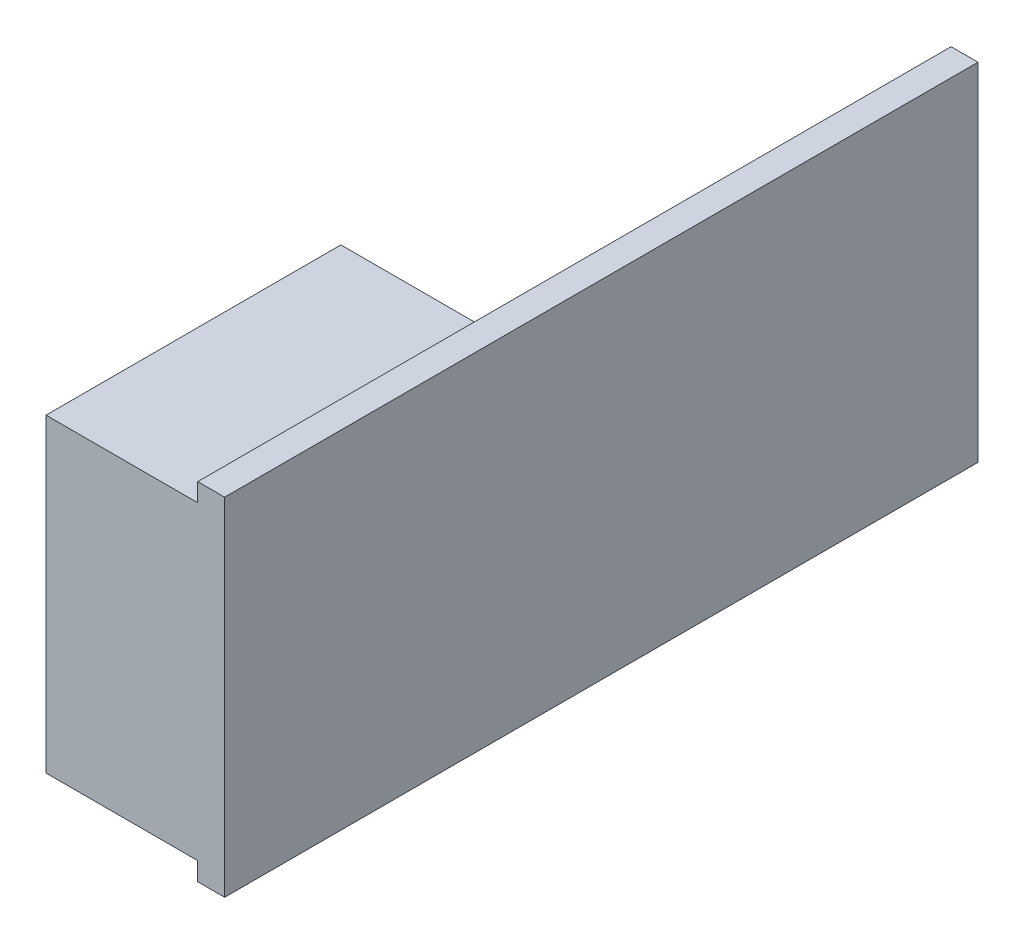
ISO-10303-21;
HEADER;
FILE_DESCRIPTION(('STEP AP214'),'2;1');
FILE_NAME('part.step','',(''),(''),'','','');
FILE_SCHEMA(('AUTOMOTIVE_DESIGN { 1 0 10303 214 1 1 1 1 }'));
ENDSEC;
DATA;
#1=APPLICATION_CONTEXT('core data for automotive mechanical design processes');
#2=APPLICATION_PROTOCOL_DEFINITION('international standard','automotive_design',2000,#1);
#3=PRODUCT_CONTEXT('',#1,'mechanical');
#4=PRODUCT('Part','Part','',(#3));
#5=PRODUCT_RELATED_PRODUCT_CATEGORY('part','',(#4));
#6=PRODUCT_DEFINITION_FORMATION('','',#4);
#7=PRODUCT_DEFINITION_CONTEXT('part definition',#1,'design');
#8=PRODUCT_DEFINITION('design','',#6,#7);
#9=PRODUCT_DEFINITION_SHAPE('','',#8);
#10=(LENGTH_UNIT() NAMED_UNIT(*) SI_UNIT(.MILLI.,.METRE.));
#11=(NAMED_UNIT(*) PLANE_ANGLE_UNIT() SI_UNIT($,.RADIAN.));
#12=(NAMED_UNIT(*) SI_UNIT($,.STERADIAN.) SOLID_ANGLE_UNIT());
#13=UNCERTAINTY_MEASURE_WITH_UNIT(LENGTH_MEASURE(1.E-05),#10,'distance_accuracy_value','');
#14=(GEOMETRIC_REPRESENTATION_CONTEXT(3) GLOBAL_UNCERTAINTY_ASSIGNED_CONTEXT((#13)) GLOBAL_UNIT_ASSIGNED_CONTEXT((#10,
#11,#12)) REPRESENTATION_CONTEXT('',''));
#15=CARTESIAN_POINT('',(0.,0.,0.));
#16=DIRECTION('',(0.,0.,1.));
#17=DIRECTION('',(1.,0.,0.));
#18=AXIS2_PLACEMENT_3D('',#15,#16,#17);
#19=CARTESIAN_POINT('',(79.85,0.,0.));
#20=DIRECTION('',(-1.,0.,0.));
#21=DIRECTION('',(0.,0.,1.));
#22=AXIS2_PLACEMENT_3D('',#19,#20,#21);
#23=PLANE('',#22);
#24=DIRECTION('',(0.,-1.,0.));
#25=VECTOR('',#24,1.);
#26=CARTESIAN_POINT('',(79.85,0.,51.4062252739507));
#27=LINE('',#26,#25);
#28=CARTESIAN_POINT('',(79.85,10.4509385299925,51.4062252739507));
#29=VERTEX_POINT('',#28);
#30=CARTESIAN_POINT('',(79.85,-3.94906147000751,51.4062252739507));
#31=VERTEX_POINT('',#30);
#32=EDGE_CURVE('E49',#29,#31,#27,.T.);
#33=ORIENTED_EDGE('',*,*,#32,.F.);
#34=DIRECTION('',(0.,0.,1.));
#35=VECTOR('',#34,1.);
#36=CARTESIAN_POINT('',(79.85,10.4509385299924,0.));
#37=LINE('',#36,#35);
#38=CARTESIAN_POINT('',(79.85,10.4509385299925,65.1062252739507));
#39=VERTEX_POINT('',#38);
#40=EDGE_CURVE('E116',#29,#39,#37,.T.);
#41=ORIENTED_EDGE('',*,*,#40,.T.);
#42=DIRECTION('',(0.,-1.,0.));
#43=VECTOR('',#42,1.);
#44=CARTESIAN_POINT('',(79.85,11.3009385299925,65.1062252739507));
#45=LINE('',#44,#43);
#46=CARTESIAN_POINT('',(79.85,11.3009385299925,65.1062252739507));
#47=VERTEX_POINT('',#46);
#48=EDGE_CURVE('E136',#47,#39,#45,.T.);
#49=ORIENTED_EDGE('',*,*,#48,.F.);
#50=DIRECTION('',(0.,0.,1.));
#51=VECTOR('',#50,1.);
#52=CARTESIAN_POINT('',(79.85,11.3009385299925,30.1062252739507));
#53=LINE('',#52,#51);
#54=CARTESIAN_POINT('',(79.85,11.3009385299925,30.1062252739507));
#55=VERTEX_POINT('',#54);
#56=EDGE_CURVE('E139',#55,#47,#53,.T.);
#57=ORIENTED_EDGE('',*,*,#56,.F.);
#58=DIRECTION('',(0.,-1.,0.));
#59=VECTOR('',#58,1.);
#60=CARTESIAN_POINT('',(79.85,11.3009385299925,30.1062252739507));
#61=LINE('',#60,#59);
#62=CARTESIAN_POINT('',(79.85,-4.7990614700075,30.1062252739507));
#63=VERTEX_POINT('',#62);
#64=EDGE_CURVE('E128',#55,#63,#61,.T.);
#65=ORIENTED_EDGE('',*,*,#64,.T.);
#66=DIRECTION('',(0.,0.,1.));
#67=VECTOR('',#66,1.);
#68=CARTESIAN_POINT('',(79.85,-4.7990614700075,30.1062252739507));
#69=LINE('',#68,#67);
#70=CARTESIAN_POINT('',(79.85,-4.7990614700075,65.1062252739507));
#71=VERTEX_POINT('',#70);
#72=EDGE_CURVE('E131',#63,#71,#69,.T.);
#73=ORIENTED_EDGE('',*,*,#72,.T.);
#74=CARTESIAN_POINT('',(79.85,-3.94906147000751,65.1062252739507));
#75=VERTEX_POINT('',#74);
#76=EDGE_CURVE('E135',#75,#71,#45,.T.);
#77=ORIENTED_EDGE('',*,*,#76,.F.);
#78=DIRECTION('',(0.,0.,1.));
#79=VECTOR('',#78,1.);
#80=CARTESIAN_POINT('',(79.85,-3.94906147000751,0.));
#81=LINE('',#80,#79);
#82=EDGE_CURVE('E54',#31,#75,#81,.T.);
#83=ORIENTED_EDGE('',*,*,#82,.F.);
#84=EDGE_LOOP('',(#33,#41,#49,#57,#65,#73,#77,#83));
#85=FACE_BOUND('',#84,.T.);
#86=ADVANCED_FACE('F34',(#85),#23,.T.);
#87=CARTESIAN_POINT('',(79.85,11.3009385299925,30.1062252739507));
#88=DIRECTION('',(0.,0.,1.));
#89=DIRECTION('',(1.,0.,0.));
#90=AXIS2_PLACEMENT_3D('',#87,#88,#89);
#91=PLANE('',#90);
#92=DIRECTION('',(0.,-1.,0.));
#93=VECTOR('',#92,1.);
#94=CARTESIAN_POINT('',(81.1,11.3009385299925,30.1062252739507));
#95=LINE('',#94,#93);
#96=CARTESIAN_POINT('',(81.1,11.3009385299925,30.1062252739507));
#97=VERTEX_POINT('',#96);
#98=CARTESIAN_POINT('',(81.1,-4.7990614700075,30.1062252739507));
#99=VERTEX_POINT('',#98);
#100=EDGE_CURVE('E119',#97,#99,#95,.T.);
#101=ORIENTED_EDGE('',*,*,#100,.T.);
#102=DIRECTION('',(1.,0.,0.));
#103=VECTOR('',#102,1.);
#104=CARTESIAN_POINT('',(79.85,-4.7990614700075,30.1062252739507));
#105=LINE('',#104,#103);
#106=EDGE_CURVE('E11',#63,#99,#105,.T.);
#107=ORIENTED_EDGE('',*,*,#106,.F.);
#108=ORIENTED_EDGE('',*,*,#64,.F.);
#109=DIRECTION('',(1.,0.,0.));
#110=VECTOR('',#109,1.);
#111=CARTESIAN_POINT('',(79.85,11.3009385299925,30.1062252739507));
#112=LINE('',#111,#110);
#113=EDGE_CURVE('E141',#55,#97,#112,.T.);
#114=ORIENTED_EDGE('',*,*,#113,.T.);
#115=EDGE_LOOP('',(#101,#107,#108,#114));
#116=FACE_BOUND('',#115,.T.);
#117=ADVANCED_FACE('F36',(#116),#91,.F.);
#118=CARTESIAN_POINT('',(79.85,-4.7990614700075,30.1062252739507));
#119=DIRECTION('',(0.,1.,0.));
#120=DIRECTION('',(0.,0.,1.));
#121=AXIS2_PLACEMENT_3D('',#118,#119,#120);
#122=PLANE('',#121);
#123=DIRECTION('',(0.,0.,1.));
#124=VECTOR('',#123,1.);
#125=CARTESIAN_POINT('',(81.1,-4.7990614700075,30.1062252739507));
#126=LINE('',#125,#124);
#127=CARTESIAN_POINT('',(81.1,-4.7990614700075,65.1062252739507));
#128=VERTEX_POINT('',#127);
#129=EDGE_CURVE('E122',#99,#128,#126,.T.);
#130=ORIENTED_EDGE('',*,*,#129,.T.);
#131=DIRECTION('',(1.,0.,0.));
#132=VECTOR('',#131,1.);
#133=CARTESIAN_POINT('',(79.85,-4.7990614700075,65.1062252739507));
#134=LINE('',#133,#132);
#135=EDGE_CURVE('E42',#71,#128,#134,.T.);
#136=ORIENTED_EDGE('',*,*,#135,.F.);
#137=ORIENTED_EDGE('',*,*,#72,.F.);
#138=ORIENTED_EDGE('',*,*,#106,.T.);
#139=EDGE_LOOP('',(#130,#136,#137,#138));
#140=FACE_BOUND('',#139,.T.);
#141=ADVANCED_FACE('F157',(#140),#122,.F.);
#142=CARTESIAN_POINT('',(79.85,11.3009385299925,65.1062252739507));
#143=DIRECTION('',(0.,0.,1.));
#144=DIRECTION('',(1.,0.,0.));
#145=AXIS2_PLACEMENT_3D('',#142,#143,#144);
#146=PLANE('',#145);
#147=DIRECTION('',(0.,-1.,0.));
#148=VECTOR('',#147,1.);
#149=CARTESIAN_POINT('',(81.1,11.3009385299925,65.1062252739507));
#150=LINE('',#149,#148);
#151=CARTESIAN_POINT('',(81.1,11.3009385299925,65.1062252739507));
#152=VERTEX_POINT('',#151);
#153=EDGE_CURVE('E145',#152,#128,#150,.T.);
#154=ORIENTED_EDGE('',*,*,#153,.F.);
#155=DIRECTION('',(1.,0.,0.));
#156=VECTOR('',#155,1.);
#157=CARTESIAN_POINT('',(79.85,11.3009385299925,65.1062252739507));
#158=LINE('',#157,#156);
#159=EDGE_CURVE('E151',#47,#152,#158,.T.);
#160=ORIENTED_EDGE('',*,*,#159,.F.);
#161=ORIENTED_EDGE('',*,*,#48,.T.);
#162=DIRECTION('',(1.,0.,0.));
#163=VECTOR('',#162,1.);
#164=CARTESIAN_POINT('',(72.8,10.4509385299925,65.1062252739507));
#165=LINE('',#164,#163);
#166=CARTESIAN_POINT('',(72.8,10.4509385299925,65.1062252739507));
#167=VERTEX_POINT('',#166);
#168=EDGE_CURVE('E124',#167,#39,#165,.T.);
#169=ORIENTED_EDGE('',*,*,#168,.F.);
#170=DIRECTION('',(0.,-1.,0.));
#171=VECTOR('',#170,1.);
#172=CARTESIAN_POINT('',(72.8,0.,65.1062252739507));
#173=LINE('',#172,#171);
#174=CARTESIAN_POINT('',(72.8,-3.94906147000751,65.1062252739507));
#175=VERTEX_POINT('',#174);
#176=EDGE_CURVE('E107',#167,#175,#173,.T.);
#177=ORIENTED_EDGE('',*,*,#176,.T.);
#178=DIRECTION('',(1.,0.,0.));
#179=VECTOR('',#178,1.);
#180=CARTESIAN_POINT('',(72.8,-3.94906147000751,65.1062252739507));
#181=LINE('',#180,#179);
#182=EDGE_CURVE('E103',#175,#75,#181,.T.);
#183=ORIENTED_EDGE('',*,*,#182,.T.);
#184=ORIENTED_EDGE('',*,*,#76,.T.);
#185=ORIENTED_EDGE('',*,*,#135,.T.);
#186=EDGE_LOOP('',(#154,#160,#161,#169,#177,#183,#184,#185));
#187=FACE_BOUND('',#186,.T.);
#188=ADVANCED_FACE('F155',(#187),#146,.T.);
#189=CARTESIAN_POINT('',(79.85,11.3009385299925,30.1062252739507));
#190=DIRECTION('',(0.,1.,0.));
#191=DIRECTION('',(0.,0.,1.));
#192=AXIS2_PLACEMENT_3D('',#189,#190,#191);
#193=PLANE('',#192);
#194=DIRECTION('',(0.,0.,1.));
#195=VECTOR('',#194,1.);
#196=CARTESIAN_POINT('',(81.1,11.3009385299925,30.1062252739507));
#197=LINE('',#196,#195);
#198=EDGE_CURVE('E132',#97,#152,#197,.T.);
#199=ORIENTED_EDGE('',*,*,#198,.F.);
#200=ORIENTED_EDGE('',*,*,#113,.F.);
#201=ORIENTED_EDGE('',*,*,#56,.T.);
#202=ORIENTED_EDGE('',*,*,#159,.T.);
#203=EDGE_LOOP('',(#199,#200,#201,#202));
#204=FACE_BOUND('',#203,.T.);
#205=ADVANCED_FACE('F164',(#204),#193,.T.);
#206=CARTESIAN_POINT('',(81.1,0.,0.));
#207=DIRECTION('',(-1.,0.,0.));
#208=DIRECTION('',(0.,0.,1.));
#209=AXIS2_PLACEMENT_3D('',#206,#207,#208);
#210=PLANE('',#209);
#211=ORIENTED_EDGE('',*,*,#100,.F.);
#212=ORIENTED_EDGE('',*,*,#198,.T.);
#213=ORIENTED_EDGE('',*,*,#153,.T.);
#214=ORIENTED_EDGE('',*,*,#129,.F.);
#215=EDGE_LOOP('',(#211,#212,#213,#214));
#216=FACE_BOUND('',#215,.T.);
#217=ADVANCED_FACE('F161',(#216),#210,.F.);
#218=CARTESIAN_POINT('',(72.8,0.,51.4062252739507));
#219=DIRECTION('',(0.,0.,1.));
#220=DIRECTION('',(1.,0.,0.));
#221=AXIS2_PLACEMENT_3D('',#218,#219,#220);
#222=PLANE('',#221);
#223=ORIENTED_EDGE('',*,*,#32,.T.);
#224=DIRECTION('',(1.,0.,0.));
#225=VECTOR('',#224,1.);
#226=CARTESIAN_POINT('',(72.8,-3.94906147000751,51.4062252739507));
#227=LINE('',#226,#225);
#228=CARTESIAN_POINT('',(72.8,-3.94906147000751,51.4062252739507));
#229=VERTEX_POINT('',#228);
#230=EDGE_CURVE('E101',#229,#31,#227,.T.);
#231=ORIENTED_EDGE('',*,*,#230,.F.);
#232=DIRECTION('',(0.,-1.,0.));
#233=VECTOR('',#232,1.);
#234=CARTESIAN_POINT('',(72.8,0.,51.4062252739507));
#235=LINE('',#234,#233);
#236=CARTESIAN_POINT('',(72.8,10.4509385299925,51.4062252739507));
#237=VERTEX_POINT('',#236);
#238=EDGE_CURVE('E108',#237,#229,#235,.T.);
#239=ORIENTED_EDGE('',*,*,#238,.F.);
#240=DIRECTION('',(1.,0.,0.));
#241=VECTOR('',#240,1.);
#242=CARTESIAN_POINT('',(72.8,10.4509385299925,51.4062252739507));
#243=LINE('',#242,#241);
#244=EDGE_CURVE('E175',#237,#29,#243,.T.);
#245=ORIENTED_EDGE('',*,*,#244,.T.);
#246=EDGE_LOOP('',(#223,#231,#239,#245));
#247=FACE_BOUND('',#246,.T.);
#248=ADVANCED_FACE('F118',(#247),#222,.F.);
#249=CARTESIAN_POINT('',(72.8,-3.94906147000751,0.));
#250=DIRECTION('',(0.,1.,0.));
#251=DIRECTION('',(0.,0.,1.));
#252=AXIS2_PLACEMENT_3D('',#249,#250,#251);
#253=PLANE('',#252);
#254=ORIENTED_EDGE('',*,*,#82,.T.);
#255=ORIENTED_EDGE('',*,*,#182,.F.);
#256=DIRECTION('',(0.,0.,1.));
#257=VECTOR('',#256,1.);
#258=CARTESIAN_POINT('',(72.8,-3.94906147000751,0.));
#259=LINE('',#258,#257);
#260=EDGE_CURVE('E97',#229,#175,#259,.T.);
#261=ORIENTED_EDGE('',*,*,#260,.F.);
#262=ORIENTED_EDGE('',*,*,#230,.T.);
#263=EDGE_LOOP('',(#254,#255,#261,#262));
#264=FACE_BOUND('',#263,.T.);
#265=ADVANCED_FACE('F99',(#264),#253,.F.);
#266=CARTESIAN_POINT('',(72.8,10.4509385299924,0.));
#267=DIRECTION('',(0.,1.,0.));
#268=DIRECTION('',(0.,0.,1.));
#269=AXIS2_PLACEMENT_3D('',#266,#267,#268);
#270=PLANE('',#269);
#271=ORIENTED_EDGE('',*,*,#40,.F.);
#272=ORIENTED_EDGE('',*,*,#244,.F.);
#273=DIRECTION('',(0.,0.,1.));
#274=VECTOR('',#273,1.);
#275=CARTESIAN_POINT('',(72.8,10.4509385299924,0.));
#276=LINE('',#275,#274);
#277=EDGE_CURVE('E114',#237,#167,#276,.T.);
#278=ORIENTED_EDGE('',*,*,#277,.T.);
#279=ORIENTED_EDGE('',*,*,#168,.T.);
#280=EDGE_LOOP('',(#271,#272,#278,#279));
#281=FACE_BOUND('',#280,.T.);
#282=ADVANCED_FACE('F176',(#281),#270,.T.);
#283=CARTESIAN_POINT('',(72.8,0.,0.));
#284=DIRECTION('',(-1.,0.,0.));
#285=DIRECTION('',(0.,0.,1.));
#286=AXIS2_PLACEMENT_3D('',#283,#284,#285);
#287=PLANE('',#286);
#288=ORIENTED_EDGE('',*,*,#238,.T.);
#289=ORIENTED_EDGE('',*,*,#260,.T.);
#290=ORIENTED_EDGE('',*,*,#176,.F.);
#291=ORIENTED_EDGE('',*,*,#277,.F.);
#292=EDGE_LOOP('',(#288,#289,#290,#291));
#293=FACE_BOUND('',#292,.T.);
#294=ADVANCED_FACE('F112',(#293),#287,.T.);
#295=CLOSED_SHELL('',(#86,#117,#141,#188,#205,#217,#248,#265,#282,#294));
#296=MANIFOLD_SOLID_BREP('B2',#295);
#297=ADVANCED_BREP_SHAPE_REPRESENTATION('',(#18,#296),#14);
#298=SHAPE_DEFINITION_REPRESENTATION(#9,#297);
ENDSEC;
END-ISO-10303-21;
